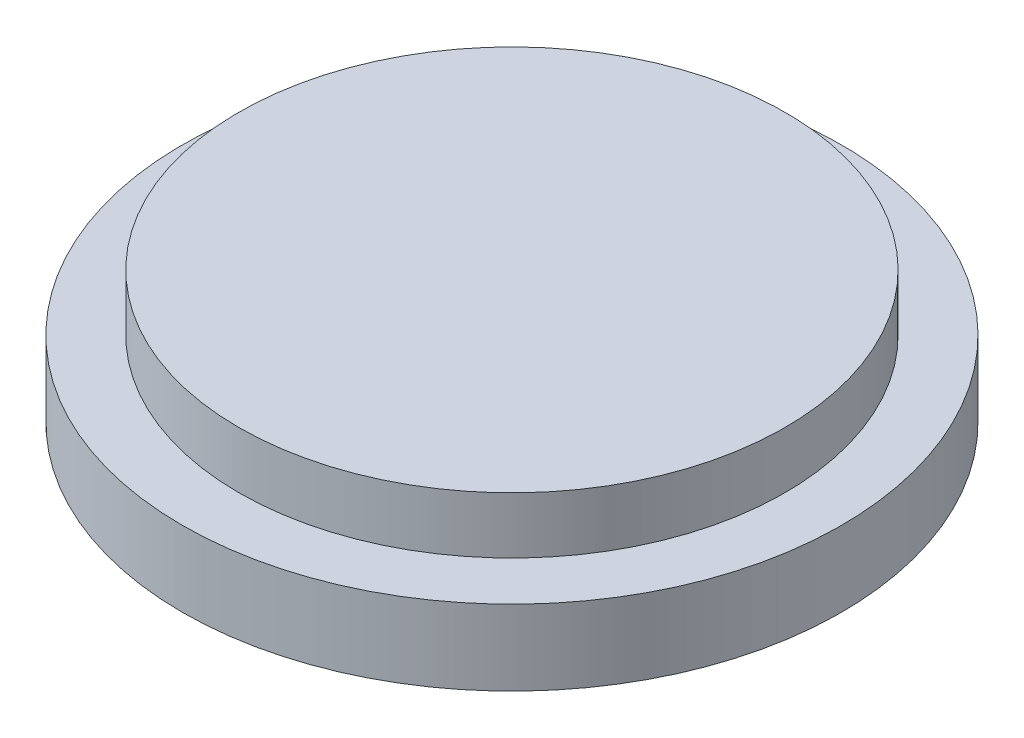
ISO-10303-21;
HEADER;
FILE_DESCRIPTION(('STEP AP214'),'2;1');
FILE_NAME('part.step','',(''),(''),'','','');
FILE_SCHEMA(('AUTOMOTIVE_DESIGN { 1 0 10303 214 1 1 1 1 }'));
ENDSEC;
DATA;
#1=APPLICATION_CONTEXT('core data for automotive mechanical design processes');
#2=APPLICATION_PROTOCOL_DEFINITION('international standard','automotive_design',2000,#1);
#3=PRODUCT_CONTEXT('',#1,'mechanical');
#4=PRODUCT('Part','Part','',(#3));
#5=PRODUCT_RELATED_PRODUCT_CATEGORY('part','',(#4));
#6=PRODUCT_DEFINITION_FORMATION('','',#4);
#7=PRODUCT_DEFINITION_CONTEXT('part definition',#1,'design');
#8=PRODUCT_DEFINITION('design','',#6,#7);
#9=PRODUCT_DEFINITION_SHAPE('','',#8);
#10=(LENGTH_UNIT() NAMED_UNIT(*) SI_UNIT(.MILLI.,.METRE.));
#11=(NAMED_UNIT(*) PLANE_ANGLE_UNIT() SI_UNIT($,.RADIAN.));
#12=(NAMED_UNIT(*) SI_UNIT($,.STERADIAN.) SOLID_ANGLE_UNIT());
#13=UNCERTAINTY_MEASURE_WITH_UNIT(LENGTH_MEASURE(1.E-05),#10,'distance_accuracy_value','');
#14=(GEOMETRIC_REPRESENTATION_CONTEXT(3) GLOBAL_UNCERTAINTY_ASSIGNED_CONTEXT((#13)) GLOBAL_UNIT_ASSIGNED_CONTEXT((#10,
#11,#12)) REPRESENTATION_CONTEXT('',''));
#15=CARTESIAN_POINT('',(0.,0.,0.));
#16=DIRECTION('',(0.,0.,1.));
#17=DIRECTION('',(1.,0.,0.));
#18=AXIS2_PLACEMENT_3D('',#15,#16,#17);
#19=CARTESIAN_POINT('',(0.,8.,0.));
#20=DIRECTION('',(0.,-1.,0.));
#21=DIRECTION('',(0.,0.,-1.));
#22=AXIS2_PLACEMENT_3D('',#19,#20,#21);
#23=CYLINDRICAL_SURFACE('',#22,35.);
#24=CARTESIAN_POINT('',(0.,8.,0.));
#25=DIRECTION('',(0.,1.,0.));
#26=DIRECTION('',(0.,0.,1.));
#27=AXIS2_PLACEMENT_3D('',#24,#25,#26);
#28=CIRCLE('',#27,35.);
#29=CARTESIAN_POINT('',(0.,8.,35.));
#30=VERTEX_POINT('',#29);
#31=EDGE_CURVE('E10',#30,#30,#28,.T.);
#32=ORIENTED_EDGE('',*,*,#31,.F.);
#33=EDGE_LOOP('',(#32));
#34=FACE_BOUND('',#33,.T.);
#35=CARTESIAN_POINT('',(0.,0.,0.));
#36=DIRECTION('',(0.,1.,0.));
#37=DIRECTION('',(0.,0.,1.));
#38=AXIS2_PLACEMENT_3D('',#35,#36,#37);
#39=CIRCLE('',#38,35.);
#40=CARTESIAN_POINT('',(0.,0.,35.));
#41=VERTEX_POINT('',#40);
#42=EDGE_CURVE('E42',#41,#41,#39,.T.);
#43=ORIENTED_EDGE('',*,*,#42,.T.);
#44=EDGE_LOOP('',(#43));
#45=FACE_BOUND('',#44,.T.);
#46=ADVANCED_FACE('F41',(#34,#45),#23,.T.);
#47=CARTESIAN_POINT('',(0.,8.,0.));
#48=DIRECTION('',(0.,1.,0.));
#49=DIRECTION('',(0.,0.,1.));
#50=AXIS2_PLACEMENT_3D('',#47,#48,#49);
#51=PLANE('',#50);
#52=CARTESIAN_POINT('',(0.,8.,0.));
#53=DIRECTION('',(0.,1.,0.));
#54=DIRECTION('',(0.,0.,1.));
#55=AXIS2_PLACEMENT_3D('',#52,#53,#54);
#56=CIRCLE('',#55,29.);
#57=CARTESIAN_POINT('',(0.,8.,29.));
#58=VERTEX_POINT('',#57);
#59=EDGE_CURVE('E51',#58,#58,#56,.F.);
#60=ORIENTED_EDGE('',*,*,#59,.T.);
#61=EDGE_LOOP('',(#60));
#62=FACE_BOUND('',#61,.T.);
#63=ORIENTED_EDGE('',*,*,#31,.T.);
#64=EDGE_LOOP('',(#63));
#65=FACE_BOUND('',#64,.T.);
#66=ADVANCED_FACE('F72',(#62,#65),#51,.T.);
#67=CARTESIAN_POINT('',(0.,0.,0.));
#68=DIRECTION('',(0.,1.,0.));
#69=DIRECTION('',(0.,0.,1.));
#70=AXIS2_PLACEMENT_3D('',#67,#68,#69);
#71=PLANE('',#70);
#72=ORIENTED_EDGE('',*,*,#42,.F.);
#73=EDGE_LOOP('',(#72));
#74=FACE_BOUND('',#73,.T.);
#75=ADVANCED_FACE('F64',(#74),#71,.F.);
#76=CARTESIAN_POINT('',(0.,14.,0.));
#77=DIRECTION('',(0.,-1.,0.));
#78=DIRECTION('',(0.,0.,-1.));
#79=AXIS2_PLACEMENT_3D('',#76,#77,#78);
#80=CYLINDRICAL_SURFACE('',#79,29.);
#81=ORIENTED_EDGE('',*,*,#59,.F.);
#82=EDGE_LOOP('',(#81));
#83=FACE_BOUND('',#82,.T.);
#84=CARTESIAN_POINT('',(0.,14.,0.));
#85=DIRECTION('',(0.,1.,0.));
#86=DIRECTION('',(0.,0.,1.));
#87=AXIS2_PLACEMENT_3D('',#84,#85,#86);
#88=CIRCLE('',#87,29.);
#89=CARTESIAN_POINT('',(0.,14.,29.));
#90=VERTEX_POINT('',#89);
#91=EDGE_CURVE('E54',#90,#90,#88,.T.);
#92=ORIENTED_EDGE('',*,*,#91,.F.);
#93=EDGE_LOOP('',(#92));
#94=FACE_BOUND('',#93,.T.);
#95=ADVANCED_FACE('F62',(#83,#94),#80,.T.);
#96=CARTESIAN_POINT('',(0.,14.,0.));
#97=DIRECTION('',(0.,1.,0.));
#98=DIRECTION('',(0.,0.,1.));
#99=AXIS2_PLACEMENT_3D('',#96,#97,#98);
#100=PLANE('',#99);
#101=ORIENTED_EDGE('',*,*,#91,.T.);
#102=EDGE_LOOP('',(#101));
#103=FACE_BOUND('',#102,.T.);
#104=ADVANCED_FACE('F56',(#103),#100,.T.);
#105=CLOSED_SHELL('',(#46,#66,#75,#95,#104));
#106=MANIFOLD_SOLID_BREP('B2',#105);
#107=ADVANCED_BREP_SHAPE_REPRESENTATION('',(#18,#106),#14);
#108=SHAPE_DEFINITION_REPRESENTATION(#9,#107);
ENDSEC;
END-ISO-10303-21;
